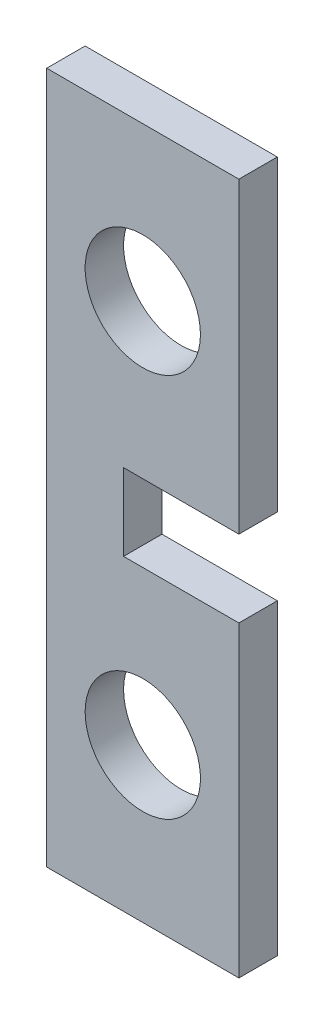
ISO-10303-21;
HEADER;
FILE_DESCRIPTION(('STEP AP214'),'2;1');
FILE_NAME('part.step','',(''),(''),'','','');
FILE_SCHEMA(('AUTOMOTIVE_DESIGN { 1 0 10303 214 1 1 1 1 }'));
ENDSEC;
DATA;
#1=APPLICATION_CONTEXT('core data for automotive mechanical design processes');
#2=APPLICATION_PROTOCOL_DEFINITION('international standard','automotive_design',2000,#1);
#3=PRODUCT_CONTEXT('',#1,'mechanical');
#4=PRODUCT('Part','Part','',(#3));
#5=PRODUCT_RELATED_PRODUCT_CATEGORY('part','',(#4));
#6=PRODUCT_DEFINITION_FORMATION('','',#4);
#7=PRODUCT_DEFINITION_CONTEXT('part definition',#1,'design');
#8=PRODUCT_DEFINITION('design','',#6,#7);
#9=PRODUCT_DEFINITION_SHAPE('','',#8);
#10=(LENGTH_UNIT() NAMED_UNIT(*) SI_UNIT(.MILLI.,.METRE.));
#11=(NAMED_UNIT(*) PLANE_ANGLE_UNIT() SI_UNIT($,.RADIAN.));
#12=(NAMED_UNIT(*) SI_UNIT($,.STERADIAN.) SOLID_ANGLE_UNIT());
#13=UNCERTAINTY_MEASURE_WITH_UNIT(LENGTH_MEASURE(1.E-05),#10,'distance_accuracy_value','');
#14=(GEOMETRIC_REPRESENTATION_CONTEXT(3) GLOBAL_UNCERTAINTY_ASSIGNED_CONTEXT((#13)) GLOBAL_UNIT_ASSIGNED_CONTEXT((#10,
#11,#12)) REPRESENTATION_CONTEXT('',''));
#15=CARTESIAN_POINT('',(0.,0.,0.));
#16=DIRECTION('',(0.,0.,1.));
#17=DIRECTION('',(1.,0.,0.));
#18=AXIS2_PLACEMENT_3D('',#15,#16,#17);
#19=CARTESIAN_POINT('',(2.5,-9.,1.));
#20=DIRECTION('',(-1.,0.,0.));
#21=DIRECTION('',(0.,0.,1.));
#22=AXIS2_PLACEMENT_3D('',#19,#20,#21);
#23=PLANE('',#22);
#24=DIRECTION('',(0.,1.,0.));
#25=VECTOR('',#24,1.);
#26=CARTESIAN_POINT('',(2.5,-9.,0.));
#27=LINE('',#26,#25);
#28=CARTESIAN_POINT('',(2.5,-9.,0.));
#29=VERTEX_POINT('',#28);
#30=CARTESIAN_POINT('',(2.5,-1.,0.));
#31=VERTEX_POINT('',#30);
#32=EDGE_CURVE('E127',#29,#31,#27,.T.);
#33=ORIENTED_EDGE('',*,*,#32,.T.);
#34=DIRECTION('',(0.,0.,1.));
#35=VECTOR('',#34,1.);
#36=CARTESIAN_POINT('',(2.5,-1.,0.));
#37=LINE('',#36,#35);
#38=CARTESIAN_POINT('',(2.5,-1.,1.));
#39=VERTEX_POINT('',#38);
#40=EDGE_CURVE('E157',#31,#39,#37,.T.);
#41=ORIENTED_EDGE('',*,*,#40,.T.);
#42=DIRECTION('',(0.,1.,0.));
#43=VECTOR('',#42,1.);
#44=CARTESIAN_POINT('',(2.5,-9.,1.));
#45=LINE('',#44,#43);
#46=CARTESIAN_POINT('',(2.5,-9.,1.));
#47=VERTEX_POINT('',#46);
#48=EDGE_CURVE('E158',#47,#39,#45,.T.);
#49=ORIENTED_EDGE('',*,*,#48,.F.);
#50=DIRECTION('',(0.,0.,-1.));
#51=VECTOR('',#50,1.);
#52=CARTESIAN_POINT('',(2.5,-9.,1.));
#53=LINE('',#52,#51);
#54=EDGE_CURVE('E141',#47,#29,#53,.T.);
#55=ORIENTED_EDGE('',*,*,#54,.T.);
#56=EDGE_LOOP('',(#33,#41,#49,#55));
#57=FACE_BOUND('',#56,.T.);
#58=ADVANCED_FACE('F32',(#57),#23,.F.);
#59=CARTESIAN_POINT('',(2.5,1.,1.));
#60=VERTEX_POINT('',#59);
#61=CARTESIAN_POINT('',(2.5,9.,1.));
#62=VERTEX_POINT('',#61);
#63=EDGE_CURVE('E84',#60,#62,#45,.T.);
#64=ORIENTED_EDGE('',*,*,#63,.F.);
#65=DIRECTION('',(0.,0.,1.));
#66=VECTOR('',#65,1.);
#67=CARTESIAN_POINT('',(2.5,1.,0.));
#68=LINE('',#67,#66);
#69=CARTESIAN_POINT('',(2.5,1.,0.));
#70=VERTEX_POINT('',#69);
#71=EDGE_CURVE('E110',#70,#60,#68,.T.);
#72=ORIENTED_EDGE('',*,*,#71,.F.);
#73=CARTESIAN_POINT('',(2.5,9.,0.));
#74=VERTEX_POINT('',#73);
#75=EDGE_CURVE('E118',#70,#74,#27,.T.);
#76=ORIENTED_EDGE('',*,*,#75,.T.);
#77=DIRECTION('',(0.,0.,-1.));
#78=VECTOR('',#77,1.);
#79=CARTESIAN_POINT('',(2.5,9.,1.));
#80=LINE('',#79,#78);
#81=EDGE_CURVE('E11',#62,#74,#80,.T.);
#82=ORIENTED_EDGE('',*,*,#81,.F.);
#83=EDGE_LOOP('',(#64,#72,#76,#82));
#84=FACE_BOUND('',#83,.T.);
#85=ADVANCED_FACE('F34',(#84),#23,.F.);
#86=CARTESIAN_POINT('',(-2.5,9.,1.));
#87=DIRECTION('',(0.,-1.,0.));
#88=DIRECTION('',(0.,0.,-1.));
#89=AXIS2_PLACEMENT_3D('',#86,#87,#88);
#90=PLANE('',#89);
#91=DIRECTION('',(-1.,0.,0.));
#92=VECTOR('',#91,1.);
#93=CARTESIAN_POINT('',(-2.5,9.,0.));
#94=LINE('',#93,#92);
#95=CARTESIAN_POINT('',(-2.5,9.,0.));
#96=VERTEX_POINT('',#95);
#97=EDGE_CURVE('E126',#74,#96,#94,.T.);
#98=ORIENTED_EDGE('',*,*,#97,.T.);
#99=DIRECTION('',(0.,0.,-1.));
#100=VECTOR('',#99,1.);
#101=CARTESIAN_POINT('',(-2.5,9.,1.));
#102=LINE('',#101,#100);
#103=CARTESIAN_POINT('',(-2.5,9.,1.));
#104=VERTEX_POINT('',#103);
#105=EDGE_CURVE('E40',#104,#96,#102,.T.);
#106=ORIENTED_EDGE('',*,*,#105,.F.);
#107=DIRECTION('',(-1.,0.,0.));
#108=VECTOR('',#107,1.);
#109=CARTESIAN_POINT('',(-2.5,9.,1.));
#110=LINE('',#109,#108);
#111=EDGE_CURVE('E160',#62,#104,#110,.T.);
#112=ORIENTED_EDGE('',*,*,#111,.F.);
#113=ORIENTED_EDGE('',*,*,#81,.T.);
#114=EDGE_LOOP('',(#98,#106,#112,#113));
#115=FACE_BOUND('',#114,.T.);
#116=ADVANCED_FACE('F204',(#115),#90,.F.);
#117=CARTESIAN_POINT('',(-2.5,-9.,1.));
#118=DIRECTION('',(1.,0.,0.));
#119=DIRECTION('',(0.,0.,-1.));
#120=AXIS2_PLACEMENT_3D('',#117,#118,#119);
#121=PLANE('',#120);
#122=DIRECTION('',(0.,-1.,0.));
#123=VECTOR('',#122,1.);
#124=CARTESIAN_POINT('',(-2.5,-9.,0.));
#125=LINE('',#124,#123);
#126=CARTESIAN_POINT('',(-2.5,-9.,0.));
#127=VERTEX_POINT('',#126);
#128=EDGE_CURVE('E138',#96,#127,#125,.T.);
#129=ORIENTED_EDGE('',*,*,#128,.T.);
#130=DIRECTION('',(0.,0.,-1.));
#131=VECTOR('',#130,1.);
#132=CARTESIAN_POINT('',(-2.5,-9.,1.));
#133=LINE('',#132,#131);
#134=CARTESIAN_POINT('',(-2.5,-9.,1.));
#135=VERTEX_POINT('',#134);
#136=EDGE_CURVE('E143',#135,#127,#133,.T.);
#137=ORIENTED_EDGE('',*,*,#136,.F.);
#138=DIRECTION('',(0.,-1.,0.));
#139=VECTOR('',#138,1.);
#140=CARTESIAN_POINT('',(-2.5,-9.,1.));
#141=LINE('',#140,#139);
#142=EDGE_CURVE('E150',#104,#135,#141,.T.);
#143=ORIENTED_EDGE('',*,*,#142,.F.);
#144=ORIENTED_EDGE('',*,*,#105,.T.);
#145=EDGE_LOOP('',(#129,#137,#143,#144));
#146=FACE_BOUND('',#145,.T.);
#147=ADVANCED_FACE('F148',(#146),#121,.F.);
#148=CARTESIAN_POINT('',(-2.5,-9.,1.));
#149=DIRECTION('',(0.,1.,0.));
#150=DIRECTION('',(0.,0.,1.));
#151=AXIS2_PLACEMENT_3D('',#148,#149,#150);
#152=PLANE('',#151);
#153=DIRECTION('',(1.,0.,0.));
#154=VECTOR('',#153,1.);
#155=CARTESIAN_POINT('',(-2.5,-9.,0.));
#156=LINE('',#155,#154);
#157=EDGE_CURVE('E77',#127,#29,#156,.T.);
#158=ORIENTED_EDGE('',*,*,#157,.T.);
#159=ORIENTED_EDGE('',*,*,#54,.F.);
#160=DIRECTION('',(1.,0.,0.));
#161=VECTOR('',#160,1.);
#162=CARTESIAN_POINT('',(-2.5,-9.,1.));
#163=LINE('',#162,#161);
#164=EDGE_CURVE('E56',#135,#47,#163,.T.);
#165=ORIENTED_EDGE('',*,*,#164,.F.);
#166=ORIENTED_EDGE('',*,*,#136,.T.);
#167=EDGE_LOOP('',(#158,#159,#165,#166));
#168=FACE_BOUND('',#167,.T.);
#169=ADVANCED_FACE('F159',(#168),#152,.F.);
#170=CARTESIAN_POINT('',(2.5,9.,1.));
#171=DIRECTION('',(0.,0.,-1.));
#172=DIRECTION('',(-1.,0.,0.));
#173=AXIS2_PLACEMENT_3D('',#170,#171,#172);
#174=PLANE('',#173);
#175=CARTESIAN_POINT('',(0.,-5.,1.));
#176=DIRECTION('',(0.,0.,1.));
#177=DIRECTION('',(-1.,0.,0.));
#178=AXIS2_PLACEMENT_3D('',#175,#176,#177);
#179=CIRCLE('',#178,1.5);
#180=CARTESIAN_POINT('',(-1.5,-5.,1.));
#181=VERTEX_POINT('',#180);
#182=EDGE_CURVE('E167',#181,#181,#179,.T.);
#183=ORIENTED_EDGE('',*,*,#182,.F.);
#184=EDGE_LOOP('',(#183));
#185=FACE_BOUND('',#184,.T.);
#186=CARTESIAN_POINT('',(0.,5.,1.));
#187=DIRECTION('',(0.,0.,1.));
#188=DIRECTION('',(1.,0.,0.));
#189=AXIS2_PLACEMENT_3D('',#186,#187,#188);
#190=CIRCLE('',#189,1.5);
#191=CARTESIAN_POINT('',(1.5,5.,1.));
#192=VERTEX_POINT('',#191);
#193=EDGE_CURVE('E132',#192,#192,#190,.T.);
#194=ORIENTED_EDGE('',*,*,#193,.F.);
#195=EDGE_LOOP('',(#194));
#196=FACE_BOUND('',#195,.T.);
#197=ORIENTED_EDGE('',*,*,#48,.T.);
#198=DIRECTION('',(1.,0.,0.));
#199=VECTOR('',#198,1.);
#200=CARTESIAN_POINT('',(2.5,-1.,1.));
#201=LINE('',#200,#199);
#202=CARTESIAN_POINT('',(-0.5,-1.,1.));
#203=VERTEX_POINT('',#202);
#204=EDGE_CURVE('E114',#203,#39,#201,.T.);
#205=ORIENTED_EDGE('',*,*,#204,.F.);
#206=DIRECTION('',(0.,-1.,0.));
#207=VECTOR('',#206,1.);
#208=CARTESIAN_POINT('',(-0.5,1.,1.));
#209=LINE('',#208,#207);
#210=CARTESIAN_POINT('',(-0.5,1.,1.));
#211=VERTEX_POINT('',#210);
#212=EDGE_CURVE('E177',#211,#203,#209,.T.);
#213=ORIENTED_EDGE('',*,*,#212,.F.);
#214=DIRECTION('',(-1.,0.,0.));
#215=VECTOR('',#214,1.);
#216=CARTESIAN_POINT('',(2.5,1.,1.));
#217=LINE('',#216,#215);
#218=EDGE_CURVE('E180',#60,#211,#217,.T.);
#219=ORIENTED_EDGE('',*,*,#218,.F.);
#220=ORIENTED_EDGE('',*,*,#63,.T.);
#221=ORIENTED_EDGE('',*,*,#111,.T.);
#222=ORIENTED_EDGE('',*,*,#142,.T.);
#223=ORIENTED_EDGE('',*,*,#164,.T.);
#224=EDGE_LOOP('',(#197,#205,#213,#219,#220,#221,#222,#223));
#225=FACE_BOUND('',#224,.T.);
#226=ADVANCED_FACE('F185',(#185,#196,#225),#174,.F.);
#227=CARTESIAN_POINT('',(2.5,9.,0.));
#228=DIRECTION('',(0.,0.,-1.));
#229=DIRECTION('',(-1.,0.,0.));
#230=AXIS2_PLACEMENT_3D('',#227,#228,#229);
#231=PLANE('',#230);
#232=DIRECTION('',(1.,0.,0.));
#233=VECTOR('',#232,1.);
#234=CARTESIAN_POINT('',(2.5,-1.,0.));
#235=LINE('',#234,#233);
#236=CARTESIAN_POINT('',(-0.5,-1.,0.));
#237=VERTEX_POINT('',#236);
#238=EDGE_CURVE('E120',#237,#31,#235,.T.);
#239=ORIENTED_EDGE('',*,*,#238,.T.);
#240=ORIENTED_EDGE('',*,*,#32,.F.);
#241=ORIENTED_EDGE('',*,*,#157,.F.);
#242=ORIENTED_EDGE('',*,*,#128,.F.);
#243=ORIENTED_EDGE('',*,*,#97,.F.);
#244=ORIENTED_EDGE('',*,*,#75,.F.);
#245=DIRECTION('',(-1.,0.,0.));
#246=VECTOR('',#245,1.);
#247=CARTESIAN_POINT('',(2.5,1.,0.));
#248=LINE('',#247,#246);
#249=CARTESIAN_POINT('',(-0.5,0.999999999999999,0.));
#250=VERTEX_POINT('',#249);
#251=EDGE_CURVE('E106',#70,#250,#248,.T.);
#252=ORIENTED_EDGE('',*,*,#251,.T.);
#253=DIRECTION('',(0.,-1.,0.));
#254=VECTOR('',#253,1.);
#255=CARTESIAN_POINT('',(-0.5,1.,0.));
#256=LINE('',#255,#254);
#257=EDGE_CURVE('E47',#250,#237,#256,.T.);
#258=ORIENTED_EDGE('',*,*,#257,.T.);
#259=EDGE_LOOP('',(#239,#240,#241,#242,#243,#244,#252,#258));
#260=FACE_BOUND('',#259,.T.);
#261=CARTESIAN_POINT('',(0.,-5.,0.));
#262=DIRECTION('',(0.,0.,1.));
#263=DIRECTION('',(-1.,0.,0.));
#264=AXIS2_PLACEMENT_3D('',#261,#262,#263);
#265=CIRCLE('',#264,1.5);
#266=CARTESIAN_POINT('',(-1.5,-5.,0.));
#267=VERTEX_POINT('',#266);
#268=EDGE_CURVE('E165',#267,#267,#265,.T.);
#269=ORIENTED_EDGE('',*,*,#268,.T.);
#270=EDGE_LOOP('',(#269));
#271=FACE_BOUND('',#270,.T.);
#272=CARTESIAN_POINT('',(0.,5.,0.));
#273=DIRECTION('',(0.,0.,1.));
#274=DIRECTION('',(1.,0.,0.));
#275=AXIS2_PLACEMENT_3D('',#272,#273,#274);
#276=CIRCLE('',#275,1.5);
#277=CARTESIAN_POINT('',(1.5,5.,0.));
#278=VERTEX_POINT('',#277);
#279=EDGE_CURVE('E128',#278,#278,#276,.T.);
#280=ORIENTED_EDGE('',*,*,#279,.T.);
#281=EDGE_LOOP('',(#280));
#282=FACE_BOUND('',#281,.T.);
#283=ADVANCED_FACE('F123',(#260,#271,#282),#231,.T.);
#284=CARTESIAN_POINT('',(0.,5.,0.));
#285=DIRECTION('',(0.,0.,1.));
#286=DIRECTION('',(1.,0.,0.));
#287=AXIS2_PLACEMENT_3D('',#284,#285,#286);
#288=CYLINDRICAL_SURFACE('',#287,1.5);
#289=ORIENTED_EDGE('',*,*,#279,.F.);
#290=EDGE_LOOP('',(#289));
#291=FACE_BOUND('',#290,.T.);
#292=ORIENTED_EDGE('',*,*,#193,.T.);
#293=EDGE_LOOP('',(#292));
#294=FACE_BOUND('',#293,.T.);
#295=ADVANCED_FACE('F197',(#291,#294),#288,.F.);
#296=CARTESIAN_POINT('',(0.,-5.,0.));
#297=DIRECTION('',(0.,0.,1.));
#298=DIRECTION('',(1.,0.,0.));
#299=AXIS2_PLACEMENT_3D('',#296,#297,#298);
#300=CYLINDRICAL_SURFACE('',#299,1.5);
#301=ORIENTED_EDGE('',*,*,#268,.F.);
#302=EDGE_LOOP('',(#301));
#303=FACE_BOUND('',#302,.T.);
#304=ORIENTED_EDGE('',*,*,#182,.T.);
#305=EDGE_LOOP('',(#304));
#306=FACE_BOUND('',#305,.T.);
#307=ADVANCED_FACE('F190',(#303,#306),#300,.F.);
#308=CARTESIAN_POINT('',(2.5,-1.,0.));
#309=DIRECTION('',(0.,-1.,0.));
#310=DIRECTION('',(1.,0.,0.));
#311=AXIS2_PLACEMENT_3D('',#308,#309,#310);
#312=PLANE('',#311);
#313=ORIENTED_EDGE('',*,*,#204,.T.);
#314=ORIENTED_EDGE('',*,*,#40,.F.);
#315=ORIENTED_EDGE('',*,*,#238,.F.);
#316=DIRECTION('',(0.,0.,1.));
#317=VECTOR('',#316,1.);
#318=CARTESIAN_POINT('',(-0.5,-1.,0.));
#319=LINE('',#318,#317);
#320=EDGE_CURVE('E173',#237,#203,#319,.T.);
#321=ORIENTED_EDGE('',*,*,#320,.T.);
#322=EDGE_LOOP('',(#313,#314,#315,#321));
#323=FACE_BOUND('',#322,.T.);
#324=ADVANCED_FACE('F188',(#323),#312,.F.);
#325=CARTESIAN_POINT('',(-0.5,1.,0.));
#326=DIRECTION('',(-1.,0.,0.));
#327=DIRECTION('',(0.,0.,1.));
#328=AXIS2_PLACEMENT_3D('',#325,#326,#327);
#329=PLANE('',#328);
#330=ORIENTED_EDGE('',*,*,#212,.T.);
#331=ORIENTED_EDGE('',*,*,#320,.F.);
#332=ORIENTED_EDGE('',*,*,#257,.F.);
#333=DIRECTION('',(0.,0.,1.));
#334=VECTOR('',#333,1.);
#335=CARTESIAN_POINT('',(-0.5,1.,0.));
#336=LINE('',#335,#334);
#337=EDGE_CURVE('E111',#250,#211,#336,.T.);
#338=ORIENTED_EDGE('',*,*,#337,.T.);
#339=EDGE_LOOP('',(#330,#331,#332,#338));
#340=FACE_BOUND('',#339,.T.);
#341=ADVANCED_FACE('F186',(#340),#329,.F.);
#342=CARTESIAN_POINT('',(2.5,1.,0.));
#343=DIRECTION('',(0.,1.,0.));
#344=DIRECTION('',(-1.,0.,0.));
#345=AXIS2_PLACEMENT_3D('',#342,#343,#344);
#346=PLANE('',#345);
#347=ORIENTED_EDGE('',*,*,#218,.T.);
#348=ORIENTED_EDGE('',*,*,#337,.F.);
#349=ORIENTED_EDGE('',*,*,#251,.F.);
#350=ORIENTED_EDGE('',*,*,#71,.T.);
#351=EDGE_LOOP('',(#347,#348,#349,#350));
#352=FACE_BOUND('',#351,.T.);
#353=ADVANCED_FACE('F109',(#352),#346,.F.);
#354=CLOSED_SHELL('',(#58,#85,#116,#147,#169,#226,#283,#295,#307,#324,#341,#353));
#355=MANIFOLD_SOLID_BREP('B2',#354);
#356=ADVANCED_BREP_SHAPE_REPRESENTATION('',(#18,#355),#14);
#357=SHAPE_DEFINITION_REPRESENTATION(#9,#356);
ENDSEC;
END-ISO-10303-21;
